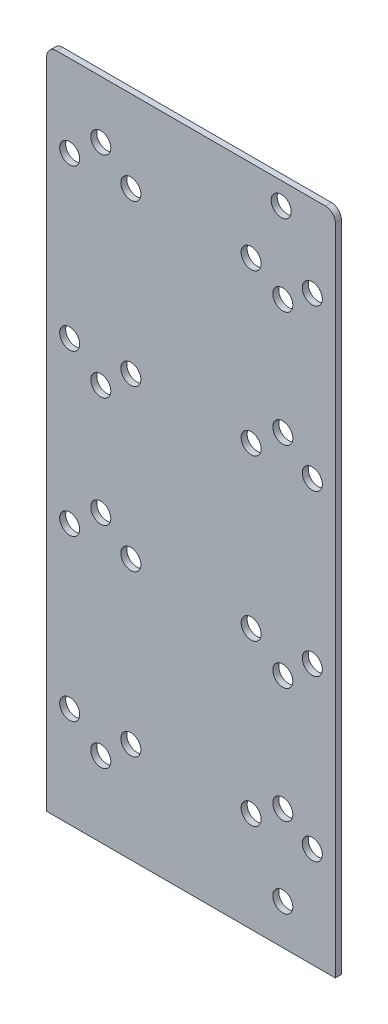
ISO-10303-21;
HEADER;
FILE_DESCRIPTION(('STEP AP214'),'2;1');
FILE_NAME('part.step','',(''),(''),'','','');
FILE_SCHEMA(('AUTOMOTIVE_DESIGN { 1 0 10303 214 1 1 1 1 }'));
ENDSEC;
DATA;
#1=APPLICATION_CONTEXT('core data for automotive mechanical design processes');
#2=APPLICATION_PROTOCOL_DEFINITION('international standard','automotive_design',2000,#1);
#3=PRODUCT_CONTEXT('',#1,'mechanical');
#4=PRODUCT('Part','Part','',(#3));
#5=PRODUCT_RELATED_PRODUCT_CATEGORY('part','',(#4));
#6=PRODUCT_DEFINITION_FORMATION('','',#4);
#7=PRODUCT_DEFINITION_CONTEXT('part definition',#1,'design');
#8=PRODUCT_DEFINITION('design','',#6,#7);
#9=PRODUCT_DEFINITION_SHAPE('','',#8);
#10=(LENGTH_UNIT() NAMED_UNIT(*) SI_UNIT(.MILLI.,.METRE.));
#11=(NAMED_UNIT(*) PLANE_ANGLE_UNIT() SI_UNIT($,.RADIAN.));
#12=(NAMED_UNIT(*) SI_UNIT($,.STERADIAN.) SOLID_ANGLE_UNIT());
#13=UNCERTAINTY_MEASURE_WITH_UNIT(LENGTH_MEASURE(1.E-05),#10,'distance_accuracy_value','');
#14=(GEOMETRIC_REPRESENTATION_CONTEXT(3) GLOBAL_UNCERTAINTY_ASSIGNED_CONTEXT((#13)) GLOBAL_UNIT_ASSIGNED_CONTEXT((#10,
#11,#12)) REPRESENTATION_CONTEXT('',''));
#15=CARTESIAN_POINT('',(0.,0.,0.));
#16=DIRECTION('',(0.,0.,1.));
#17=DIRECTION('',(1.,0.,0.));
#18=AXIS2_PLACEMENT_3D('',#15,#16,#17);
#19=CARTESIAN_POINT('',(-11.1488200453154,493.39742900995,-7.));
#20=DIRECTION('',(0.,0.,1.));
#21=DIRECTION('',(1.,0.,0.));
#22=AXIS2_PLACEMENT_3D('',#19,#20,#21);
#23=CYLINDRICAL_SURFACE('',#22,5.);
#24=CARTESIAN_POINT('',(-11.1488200453154,493.39742900995,3.));
#25=DIRECTION('',(0.,0.,1.));
#26=DIRECTION('',(1.,0.,0.));
#27=AXIS2_PLACEMENT_3D('',#24,#25,#26);
#28=CIRCLE('',#27,5.);
#29=CARTESIAN_POINT('',(-6.14882004531543,493.39742900995,3.));
#30=VERTEX_POINT('',#29);
#31=EDGE_CURVE('E165',#30,#30,#28,.T.);
#32=ORIENTED_EDGE('',*,*,#31,.T.);
#33=EDGE_LOOP('',(#32));
#34=FACE_BOUND('',#33,.T.);
#35=CARTESIAN_POINT('',(-11.1488200453154,493.39742900995,0.));
#36=DIRECTION('',(0.,0.,1.));
#37=DIRECTION('',(1.,0.,0.));
#38=AXIS2_PLACEMENT_3D('',#35,#36,#37);
#39=CIRCLE('',#38,5.);
#40=CARTESIAN_POINT('',(-6.14882004531543,493.39742900995,0.));
#41=VERTEX_POINT('',#40);
#42=EDGE_CURVE('E168',#41,#41,#39,.T.);
#43=ORIENTED_EDGE('',*,*,#42,.F.);
#44=EDGE_LOOP('',(#43));
#45=FACE_BOUND('',#44,.T.);
#46=ADVANCED_FACE('F35',(#34,#45),#23,.F.);
#47=CARTESIAN_POINT('',(-11.1488200453154,413.39742900995,-7.));
#48=DIRECTION('',(0.,0.,1.));
#49=DIRECTION('',(1.,0.,0.));
#50=AXIS2_PLACEMENT_3D('',#47,#48,#49);
#51=CYLINDRICAL_SURFACE('',#50,5.);
#52=CARTESIAN_POINT('',(-11.1488200453154,413.39742900995,3.));
#53=DIRECTION('',(0.,0.,1.));
#54=DIRECTION('',(1.,0.,0.));
#55=AXIS2_PLACEMENT_3D('',#52,#53,#54);
#56=CIRCLE('',#55,5.);
#57=CARTESIAN_POINT('',(-6.14882004531542,413.39742900995,3.));
#58=VERTEX_POINT('',#57);
#59=EDGE_CURVE('E159',#58,#58,#56,.T.);
#60=ORIENTED_EDGE('',*,*,#59,.T.);
#61=EDGE_LOOP('',(#60));
#62=FACE_BOUND('',#61,.T.);
#63=CARTESIAN_POINT('',(-11.1488200453154,413.39742900995,0.));
#64=DIRECTION('',(0.,0.,1.));
#65=DIRECTION('',(1.,0.,0.));
#66=AXIS2_PLACEMENT_3D('',#63,#64,#65);
#67=CIRCLE('',#66,5.);
#68=CARTESIAN_POINT('',(-6.14882004531542,413.39742900995,0.));
#69=VERTEX_POINT('',#68);
#70=EDGE_CURVE('E162',#69,#69,#67,.T.);
#71=ORIENTED_EDGE('',*,*,#70,.F.);
#72=EDGE_LOOP('',(#71));
#73=FACE_BOUND('',#72,.T.);
#74=ADVANCED_FACE('F205',(#62,#73),#51,.F.);
#75=CARTESIAN_POINT('',(48.8511799546846,493.39742900995,-7.));
#76=DIRECTION('',(0.,0.,1.));
#77=DIRECTION('',(1.,0.,0.));
#78=AXIS2_PLACEMENT_3D('',#75,#76,#77);
#79=CYLINDRICAL_SURFACE('',#78,5.);
#80=CARTESIAN_POINT('',(48.8511799546846,493.39742900995,3.));
#81=DIRECTION('',(0.,0.,1.));
#82=DIRECTION('',(1.,0.,0.));
#83=AXIS2_PLACEMENT_3D('',#80,#81,#82);
#84=CIRCLE('',#83,5.);
#85=CARTESIAN_POINT('',(53.8511799546846,493.39742900995,3.));
#86=VERTEX_POINT('',#85);
#87=EDGE_CURVE('E153',#86,#86,#84,.T.);
#88=ORIENTED_EDGE('',*,*,#87,.T.);
#89=EDGE_LOOP('',(#88));
#90=FACE_BOUND('',#89,.T.);
#91=CARTESIAN_POINT('',(48.8511799546846,493.39742900995,0.));
#92=DIRECTION('',(0.,0.,1.));
#93=DIRECTION('',(1.,0.,0.));
#94=AXIS2_PLACEMENT_3D('',#91,#92,#93);
#95=CIRCLE('',#94,5.);
#96=CARTESIAN_POINT('',(53.8511799546846,493.39742900995,0.));
#97=VERTEX_POINT('',#96);
#98=EDGE_CURVE('E156',#97,#97,#95,.T.);
#99=ORIENTED_EDGE('',*,*,#98,.F.);
#100=EDGE_LOOP('',(#99));
#101=FACE_BOUND('',#100,.T.);
#102=ADVANCED_FACE('F211',(#90,#101),#79,.F.);
#103=CARTESIAN_POINT('',(48.8511799546846,413.39742900995,-7.));
#104=DIRECTION('',(0.,0.,1.));
#105=DIRECTION('',(1.,0.,0.));
#106=AXIS2_PLACEMENT_3D('',#103,#104,#105);
#107=CYLINDRICAL_SURFACE('',#106,5.);
#108=CARTESIAN_POINT('',(48.8511799546846,413.39742900995,3.));
#109=DIRECTION('',(0.,0.,1.));
#110=DIRECTION('',(1.,0.,0.));
#111=AXIS2_PLACEMENT_3D('',#108,#109,#110);
#112=CIRCLE('',#111,5.);
#113=CARTESIAN_POINT('',(53.8511799546846,413.39742900995,3.));
#114=VERTEX_POINT('',#113);
#115=EDGE_CURVE('E147',#114,#114,#112,.T.);
#116=ORIENTED_EDGE('',*,*,#115,.T.);
#117=EDGE_LOOP('',(#116));
#118=FACE_BOUND('',#117,.T.);
#119=CARTESIAN_POINT('',(48.8511799546846,413.39742900995,0.));
#120=DIRECTION('',(0.,0.,1.));
#121=DIRECTION('',(1.,0.,0.));
#122=AXIS2_PLACEMENT_3D('',#119,#120,#121);
#123=CIRCLE('',#122,5.);
#124=CARTESIAN_POINT('',(53.8511799546846,413.39742900995,0.));
#125=VERTEX_POINT('',#124);
#126=EDGE_CURVE('E150',#125,#125,#123,.T.);
#127=ORIENTED_EDGE('',*,*,#126,.F.);
#128=EDGE_LOOP('',(#127));
#129=FACE_BOUND('',#128,.T.);
#130=ADVANCED_FACE('F218',(#118,#129),#107,.F.);
#131=CARTESIAN_POINT('',(79.3511799546846,493.39742900995,-7.));
#132=DIRECTION('',(0.,0.,1.));
#133=DIRECTION('',(1.,0.,0.));
#134=AXIS2_PLACEMENT_3D('',#131,#132,#133);
#135=CYLINDRICAL_SURFACE('',#134,5.00000000000001);
#136=CARTESIAN_POINT('',(79.3511799546846,493.39742900995,3.));
#137=DIRECTION('',(0.,0.,1.));
#138=DIRECTION('',(1.,0.,0.));
#139=AXIS2_PLACEMENT_3D('',#136,#137,#138);
#140=CIRCLE('',#139,5.00000000000001);
#141=CARTESIAN_POINT('',(84.3511799546846,493.39742900995,3.));
#142=VERTEX_POINT('',#141);
#143=EDGE_CURVE('E141',#142,#142,#140,.T.);
#144=ORIENTED_EDGE('',*,*,#143,.T.);
#145=EDGE_LOOP('',(#144));
#146=FACE_BOUND('',#145,.T.);
#147=CARTESIAN_POINT('',(79.3511799546846,493.39742900995,0.));
#148=DIRECTION('',(0.,0.,1.));
#149=DIRECTION('',(1.,0.,0.));
#150=AXIS2_PLACEMENT_3D('',#147,#148,#149);
#151=CIRCLE('',#150,5.00000000000001);
#152=CARTESIAN_POINT('',(84.3511799546846,493.39742900995,0.));
#153=VERTEX_POINT('',#152);
#154=EDGE_CURVE('E144',#153,#153,#151,.T.);
#155=ORIENTED_EDGE('',*,*,#154,.F.);
#156=EDGE_LOOP('',(#155));
#157=FACE_BOUND('',#156,.T.);
#158=ADVANCED_FACE('F222',(#146,#157),#135,.F.);
#159=CARTESIAN_POINT('',(79.3511799546846,413.39742900995,-7.));
#160=DIRECTION('',(0.,0.,1.));
#161=DIRECTION('',(1.,0.,0.));
#162=AXIS2_PLACEMENT_3D('',#159,#160,#161);
#163=CYLINDRICAL_SURFACE('',#162,5.00000000000001);
#164=CARTESIAN_POINT('',(79.3511799546846,413.39742900995,3.));
#165=DIRECTION('',(0.,0.,1.));
#166=DIRECTION('',(1.,0.,0.));
#167=AXIS2_PLACEMENT_3D('',#164,#165,#166);
#168=CIRCLE('',#167,5.00000000000001);
#169=CARTESIAN_POINT('',(84.3511799546846,413.39742900995,3.));
#170=VERTEX_POINT('',#169);
#171=EDGE_CURVE('E135',#170,#170,#168,.T.);
#172=ORIENTED_EDGE('',*,*,#171,.T.);
#173=EDGE_LOOP('',(#172));
#174=FACE_BOUND('',#173,.T.);
#175=CARTESIAN_POINT('',(79.3511799546846,413.39742900995,0.));
#176=DIRECTION('',(0.,0.,1.));
#177=DIRECTION('',(1.,0.,0.));
#178=AXIS2_PLACEMENT_3D('',#175,#176,#177);
#179=CIRCLE('',#178,5.00000000000001);
#180=CARTESIAN_POINT('',(84.3511799546846,413.39742900995,0.));
#181=VERTEX_POINT('',#180);
#182=EDGE_CURVE('E138',#181,#181,#179,.T.);
#183=ORIENTED_EDGE('',*,*,#182,.F.);
#184=EDGE_LOOP('',(#183));
#185=FACE_BOUND('',#184,.T.);
#186=ADVANCED_FACE('F226',(#174,#185),#163,.F.);
#187=CARTESIAN_POINT('',(-41.6488200453154,493.39742900995,-7.));
#188=DIRECTION('',(0.,0.,1.));
#189=DIRECTION('',(1.,0.,0.));
#190=AXIS2_PLACEMENT_3D('',#187,#188,#189);
#191=CYLINDRICAL_SURFACE('',#190,5.);
#192=CARTESIAN_POINT('',(-41.6488200453154,493.39742900995,3.));
#193=DIRECTION('',(0.,0.,1.));
#194=DIRECTION('',(1.,0.,0.));
#195=AXIS2_PLACEMENT_3D('',#192,#193,#194);
#196=CIRCLE('',#195,5.);
#197=CARTESIAN_POINT('',(-36.6488200453154,493.39742900995,3.));
#198=VERTEX_POINT('',#197);
#199=EDGE_CURVE('E129',#198,#198,#196,.T.);
#200=ORIENTED_EDGE('',*,*,#199,.T.);
#201=EDGE_LOOP('',(#200));
#202=FACE_BOUND('',#201,.T.);
#203=CARTESIAN_POINT('',(-41.6488200453154,493.39742900995,0.));
#204=DIRECTION('',(0.,0.,1.));
#205=DIRECTION('',(1.,0.,0.));
#206=AXIS2_PLACEMENT_3D('',#203,#204,#205);
#207=CIRCLE('',#206,5.);
#208=CARTESIAN_POINT('',(-36.6488200453154,493.39742900995,0.));
#209=VERTEX_POINT('',#208);
#210=EDGE_CURVE('E132',#209,#209,#207,.T.);
#211=ORIENTED_EDGE('',*,*,#210,.F.);
#212=EDGE_LOOP('',(#211));
#213=FACE_BOUND('',#212,.T.);
#214=ADVANCED_FACE('F230',(#202,#213),#191,.F.);
#215=CARTESIAN_POINT('',(-41.6488200453154,413.39742900995,-7.));
#216=DIRECTION('',(0.,0.,1.));
#217=DIRECTION('',(1.,0.,0.));
#218=AXIS2_PLACEMENT_3D('',#215,#216,#217);
#219=CYLINDRICAL_SURFACE('',#218,5.);
#220=CARTESIAN_POINT('',(-41.6488200453154,413.39742900995,3.));
#221=DIRECTION('',(0.,0.,1.));
#222=DIRECTION('',(1.,0.,0.));
#223=AXIS2_PLACEMENT_3D('',#220,#221,#222);
#224=CIRCLE('',#223,5.);
#225=CARTESIAN_POINT('',(-36.6488200453154,413.39742900995,3.));
#226=VERTEX_POINT('',#225);
#227=EDGE_CURVE('E122',#226,#226,#224,.T.);
#228=ORIENTED_EDGE('',*,*,#227,.T.);
#229=EDGE_LOOP('',(#228));
#230=FACE_BOUND('',#229,.T.);
#231=CARTESIAN_POINT('',(-41.6488200453154,413.39742900995,0.));
#232=DIRECTION('',(0.,0.,1.));
#233=DIRECTION('',(1.,0.,0.));
#234=AXIS2_PLACEMENT_3D('',#231,#232,#233);
#235=CIRCLE('',#234,5.);
#236=CARTESIAN_POINT('',(-36.6488200453154,413.39742900995,0.));
#237=VERTEX_POINT('',#236);
#238=EDGE_CURVE('E126',#237,#237,#235,.T.);
#239=ORIENTED_EDGE('',*,*,#238,.F.);
#240=EDGE_LOOP('',(#239));
#241=FACE_BOUND('',#240,.T.);
#242=ADVANCED_FACE('F234',(#230,#241),#219,.F.);
#243=CARTESIAN_POINT('',(-53.1488200453154,534.39742900995,0.));
#244=DIRECTION('',(-1.,0.,0.));
#245=DIRECTION('',(0.,-1.,0.));
#246=AXIS2_PLACEMENT_3D('',#243,#244,#245);
#247=PLANE('',#246);
#248=DIRECTION('',(0.,-1.,0.));
#249=VECTOR('',#248,1.);
#250=CARTESIAN_POINT('',(-53.1488200453154,534.39742900995,3.));
#251=LINE('',#250,#249);
#252=CARTESIAN_POINT('',(-53.1488200453154,529.39742900995,3.));
#253=VERTEX_POINT('',#252);
#254=CARTESIAN_POINT('',(-53.1488200453154,203.39742900995,3.));
#255=VERTEX_POINT('',#254);
#256=EDGE_CURVE('E113',#253,#255,#251,.T.);
#257=ORIENTED_EDGE('',*,*,#256,.F.);
#258=DIRECTION('',(0.,0.,1.));
#259=VECTOR('',#258,1.);
#260=CARTESIAN_POINT('',(-53.1488200453154,529.39742900995,0.));
#261=LINE('',#260,#259);
#262=CARTESIAN_POINT('',(-53.1488200453154,529.39742900995,0.));
#263=VERTEX_POINT('',#262);
#264=EDGE_CURVE('E11',#253,#263,#261,.F.);
#265=ORIENTED_EDGE('',*,*,#264,.T.);
#266=DIRECTION('',(0.,-1.,0.));
#267=VECTOR('',#266,1.);
#268=CARTESIAN_POINT('',(-53.1488200453154,534.39742900995,0.));
#269=LINE('',#268,#267);
#270=CARTESIAN_POINT('',(-53.1488200453154,203.39742900995,0.));
#271=VERTEX_POINT('',#270);
#272=EDGE_CURVE('E86',#263,#271,#269,.T.);
#273=ORIENTED_EDGE('',*,*,#272,.T.);
#274=DIRECTION('',(0.,0.,1.));
#275=VECTOR('',#274,1.);
#276=CARTESIAN_POINT('',(-53.1488200453154,203.39742900995,0.));
#277=LINE('',#276,#275);
#278=EDGE_CURVE('E89',#271,#255,#277,.T.);
#279=ORIENTED_EDGE('',*,*,#278,.T.);
#280=EDGE_LOOP('',(#257,#265,#273,#279));
#281=FACE_BOUND('',#280,.T.);
#282=ADVANCED_FACE('F88',(#281),#247,.T.);
#283=CARTESIAN_POINT('',(-53.1488200453154,534.39742900995,0.));
#284=DIRECTION('',(0.,1.,0.));
#285=DIRECTION('',(0.,0.,1.));
#286=AXIS2_PLACEMENT_3D('',#283,#284,#285);
#287=PLANE('',#286);
#288=DIRECTION('',(-1.,0.,0.));
#289=VECTOR('',#288,1.);
#290=CARTESIAN_POINT('',(-53.1488200453154,534.39742900995,3.));
#291=LINE('',#290,#289);
#292=CARTESIAN_POINT('',(85.8511799546846,534.39742900995,3.));
#293=VERTEX_POINT('',#292);
#294=CARTESIAN_POINT('',(-48.1488200453154,534.39742900995,3.));
#295=VERTEX_POINT('',#294);
#296=EDGE_CURVE('E93',#293,#295,#291,.T.);
#297=ORIENTED_EDGE('',*,*,#296,.F.);
#298=DIRECTION('',(0.,0.,1.));
#299=VECTOR('',#298,1.);
#300=CARTESIAN_POINT('',(85.8511799546846,534.39742900995,0.));
#301=LINE('',#300,#299);
#302=CARTESIAN_POINT('',(85.8511799546846,534.39742900995,0.));
#303=VERTEX_POINT('',#302);
#304=EDGE_CURVE('E181',#293,#303,#301,.F.);
#305=ORIENTED_EDGE('',*,*,#304,.T.);
#306=DIRECTION('',(-1.,0.,0.));
#307=VECTOR('',#306,1.);
#308=CARTESIAN_POINT('',(-53.1488200453154,534.39742900995,0.));
#309=LINE('',#308,#307);
#310=CARTESIAN_POINT('',(-48.1488200453154,534.39742900995,0.));
#311=VERTEX_POINT('',#310);
#312=EDGE_CURVE('E101',#303,#311,#309,.T.);
#313=ORIENTED_EDGE('',*,*,#312,.T.);
#314=DIRECTION('',(0.,0.,1.));
#315=VECTOR('',#314,1.);
#316=CARTESIAN_POINT('',(-48.1488200453154,534.39742900995,0.));
#317=LINE('',#316,#315);
#318=EDGE_CURVE('E178',#311,#295,#317,.T.);
#319=ORIENTED_EDGE('',*,*,#318,.T.);
#320=EDGE_LOOP('',(#297,#305,#313,#319));
#321=FACE_BOUND('',#320,.T.);
#322=ADVANCED_FACE('F196',(#321),#287,.T.);
#323=CARTESIAN_POINT('',(90.8511799546846,534.39742900995,0.));
#324=DIRECTION('',(1.,0.,0.));
#325=DIRECTION('',(0.,1.,0.));
#326=AXIS2_PLACEMENT_3D('',#323,#324,#325);
#327=PLANE('',#326);
#328=DIRECTION('',(0.,1.,0.));
#329=VECTOR('',#328,1.);
#330=CARTESIAN_POINT('',(90.8511799546846,534.39742900995,0.));
#331=LINE('',#330,#329);
#332=CARTESIAN_POINT('',(90.8511799546846,203.39742900995,0.));
#333=VERTEX_POINT('',#332);
#334=CARTESIAN_POINT('',(90.8511799546846,529.39742900995,0.));
#335=VERTEX_POINT('',#334);
#336=EDGE_CURVE('E107',#333,#335,#331,.T.);
#337=ORIENTED_EDGE('',*,*,#336,.T.);
#338=DIRECTION('',(0.,0.,1.));
#339=VECTOR('',#338,1.);
#340=CARTESIAN_POINT('',(90.8511799546846,529.39742900995,0.));
#341=LINE('',#340,#339);
#342=CARTESIAN_POINT('',(90.8511799546846,529.39742900995,3.));
#343=VERTEX_POINT('',#342);
#344=EDGE_CURVE('E171',#335,#343,#341,.T.);
#345=ORIENTED_EDGE('',*,*,#344,.T.);
#346=DIRECTION('',(0.,1.,0.));
#347=VECTOR('',#346,1.);
#348=CARTESIAN_POINT('',(90.8511799546846,534.39742900995,3.));
#349=LINE('',#348,#347);
#350=CARTESIAN_POINT('',(90.8511799546846,203.39742900995,3.));
#351=VERTEX_POINT('',#350);
#352=EDGE_CURVE('E117',#351,#343,#349,.T.);
#353=ORIENTED_EDGE('',*,*,#352,.F.);
#354=DIRECTION('',(0.,0.,1.));
#355=VECTOR('',#354,1.);
#356=CARTESIAN_POINT('',(90.8511799546846,203.39742900995,0.));
#357=LINE('',#356,#355);
#358=EDGE_CURVE('E100',#333,#351,#357,.T.);
#359=ORIENTED_EDGE('',*,*,#358,.F.);
#360=EDGE_LOOP('',(#337,#345,#353,#359));
#361=FACE_BOUND('',#360,.T.);
#362=ADVANCED_FACE('F188',(#361),#327,.T.);
#363=CARTESIAN_POINT('',(-53.1488200453154,203.39742900995,0.));
#364=DIRECTION('',(0.,-1.,0.));
#365=DIRECTION('',(0.,0.,-1.));
#366=AXIS2_PLACEMENT_3D('',#363,#364,#365);
#367=PLANE('',#366);
#368=DIRECTION('',(1.,0.,0.));
#369=VECTOR('',#368,1.);
#370=CARTESIAN_POINT('',(-53.1488200453154,203.39742900995,3.));
#371=LINE('',#370,#369);
#372=EDGE_CURVE('E99',#255,#351,#371,.T.);
#373=ORIENTED_EDGE('',*,*,#372,.F.);
#374=ORIENTED_EDGE('',*,*,#278,.F.);
#375=DIRECTION('',(1.,0.,0.));
#376=VECTOR('',#375,1.);
#377=CARTESIAN_POINT('',(-53.1488200453154,203.39742900995,0.));
#378=LINE('',#377,#376);
#379=EDGE_CURVE('E92',#271,#333,#378,.T.);
#380=ORIENTED_EDGE('',*,*,#379,.T.);
#381=ORIENTED_EDGE('',*,*,#358,.T.);
#382=EDGE_LOOP('',(#373,#374,#380,#381));
#383=FACE_BOUND('',#382,.T.);
#384=ADVANCED_FACE('F97',(#383),#367,.T.);
#385=CARTESIAN_POINT('',(0.,0.,0.));
#386=DIRECTION('',(0.,0.,1.));
#387=DIRECTION('',(1.,0.,0.));
#388=AXIS2_PLACEMENT_3D('',#385,#386,#387);
#389=PLANE('',#388);
#390=CARTESIAN_POINT('',(-11.1488200453154,333.39742900995,0.));
#391=DIRECTION('',(0.,0.,1.));
#392=DIRECTION('',(1.,0.,0.));
#393=AXIS2_PLACEMENT_3D('',#390,#391,#392);
#394=CIRCLE('',#393,5.);
#395=CARTESIAN_POINT('',(-6.14882004531541,333.39742900995,0.));
#396=VERTEX_POINT('',#395);
#397=EDGE_CURVE('E331',#396,#396,#394,.T.);
#398=ORIENTED_EDGE('',*,*,#397,.T.);
#399=EDGE_LOOP('',(#398));
#400=FACE_BOUND('',#399,.T.);
#401=CARTESIAN_POINT('',(48.8511799546846,333.39742900995,0.));
#402=DIRECTION('',(0.,0.,1.));
#403=DIRECTION('',(1.,0.,0.));
#404=AXIS2_PLACEMENT_3D('',#401,#402,#403);
#405=CIRCLE('',#404,5.);
#406=CARTESIAN_POINT('',(53.8511799546846,333.39742900995,0.));
#407=VERTEX_POINT('',#406);
#408=EDGE_CURVE('E335',#407,#407,#405,.T.);
#409=ORIENTED_EDGE('',*,*,#408,.T.);
#410=EDGE_LOOP('',(#409));
#411=FACE_BOUND('',#410,.T.);
#412=CARTESIAN_POINT('',(79.3511799546846,333.39742900995,0.));
#413=DIRECTION('',(0.,0.,1.));
#414=DIRECTION('',(1.,0.,0.));
#415=AXIS2_PLACEMENT_3D('',#412,#413,#414);
#416=CIRCLE('',#415,5.00000000000001);
#417=CARTESIAN_POINT('',(84.3511799546846,333.39742900995,0.));
#418=VERTEX_POINT('',#417);
#419=EDGE_CURVE('E344',#418,#418,#416,.T.);
#420=ORIENTED_EDGE('',*,*,#419,.T.);
#421=EDGE_LOOP('',(#420));
#422=FACE_BOUND('',#421,.T.);
#423=CARTESIAN_POINT('',(-41.6488200453154,333.39742900995,0.));
#424=DIRECTION('',(0.,0.,1.));
#425=DIRECTION('',(1.,0.,0.));
#426=AXIS2_PLACEMENT_3D('',#423,#424,#425);
#427=CIRCLE('',#426,5.);
#428=CARTESIAN_POINT('',(-36.6488200453154,333.39742900995,0.));
#429=VERTEX_POINT('',#428);
#430=EDGE_CURVE('E350',#429,#429,#427,.T.);
#431=ORIENTED_EDGE('',*,*,#430,.T.);
#432=EDGE_LOOP('',(#431));
#433=FACE_BOUND('',#432,.T.);
#434=CARTESIAN_POINT('',(-41.6488200453154,253.39742900995,0.));
#435=DIRECTION('',(0.,0.,1.));
#436=DIRECTION('',(1.,0.,0.));
#437=AXIS2_PLACEMENT_3D('',#434,#435,#436);
#438=CIRCLE('',#437,5.);
#439=CARTESIAN_POINT('',(-36.6488200453154,253.39742900995,0.));
#440=VERTEX_POINT('',#439);
#441=EDGE_CURVE('E374',#440,#440,#438,.T.);
#442=ORIENTED_EDGE('',*,*,#441,.T.);
#443=EDGE_LOOP('',(#442));
#444=FACE_BOUND('',#443,.T.);
#445=CARTESIAN_POINT('',(-11.1488200453154,253.39742900995,0.));
#446=DIRECTION('',(0.,0.,1.));
#447=DIRECTION('',(1.,0.,0.));
#448=AXIS2_PLACEMENT_3D('',#445,#446,#447);
#449=CIRCLE('',#448,5.);
#450=CARTESIAN_POINT('',(-6.1488200453154,253.39742900995,0.));
#451=VERTEX_POINT('',#450);
#452=EDGE_CURVE('E371',#451,#451,#449,.T.);
#453=ORIENTED_EDGE('',*,*,#452,.T.);
#454=EDGE_LOOP('',(#453));
#455=FACE_BOUND('',#454,.T.);
#456=CARTESIAN_POINT('',(48.8511799546846,253.39742900995,0.));
#457=DIRECTION('',(0.,0.,1.));
#458=DIRECTION('',(1.,0.,0.));
#459=AXIS2_PLACEMENT_3D('',#456,#457,#458);
#460=CIRCLE('',#459,5.);
#461=CARTESIAN_POINT('',(53.8511799546846,253.39742900995,0.));
#462=VERTEX_POINT('',#461);
#463=EDGE_CURVE('E368',#462,#462,#460,.T.);
#464=ORIENTED_EDGE('',*,*,#463,.T.);
#465=EDGE_LOOP('',(#464));
#466=FACE_BOUND('',#465,.T.);
#467=CARTESIAN_POINT('',(79.3511799546846,253.39742900995,0.));
#468=DIRECTION('',(0.,0.,1.));
#469=DIRECTION('',(1.,0.,0.));
#470=AXIS2_PLACEMENT_3D('',#467,#468,#469);
#471=CIRCLE('',#470,5.00000000000001);
#472=CARTESIAN_POINT('',(84.3511799546846,253.39742900995,0.));
#473=VERTEX_POINT('',#472);
#474=EDGE_CURVE('E357',#473,#473,#471,.T.);
#475=ORIENTED_EDGE('',*,*,#474,.T.);
#476=EDGE_LOOP('',(#475));
#477=FACE_BOUND('',#476,.T.);
#478=CARTESIAN_POINT('',(-26.1488200453154,505.89742900995,0.));
#479=DIRECTION('',(0.,0.,1.));
#480=DIRECTION('',(1.,0.,0.));
#481=AXIS2_PLACEMENT_3D('',#478,#479,#480);
#482=CIRCLE('',#481,5.);
#483=CARTESIAN_POINT('',(-21.1488200453154,505.89742900995,0.));
#484=VERTEX_POINT('',#483);
#485=EDGE_CURVE('E398',#484,#484,#482,.T.);
#486=ORIENTED_EDGE('',*,*,#485,.T.);
#487=EDGE_LOOP('',(#486));
#488=FACE_BOUND('',#487,.T.);
#489=CARTESIAN_POINT('',(-26.1488200453154,400.89742900995,0.));
#490=DIRECTION('',(0.,0.,1.));
#491=DIRECTION('',(1.,0.,0.));
#492=AXIS2_PLACEMENT_3D('',#489,#490,#491);
#493=CIRCLE('',#492,5.);
#494=CARTESIAN_POINT('',(-21.1488200453154,400.89742900995,0.));
#495=VERTEX_POINT('',#494);
#496=EDGE_CURVE('E395',#495,#495,#493,.T.);
#497=ORIENTED_EDGE('',*,*,#496,.T.);
#498=EDGE_LOOP('',(#497));
#499=FACE_BOUND('',#498,.T.);
#500=CARTESIAN_POINT('',(-26.1488200453154,345.89742900995,0.));
#501=DIRECTION('',(0.,0.,1.));
#502=DIRECTION('',(1.,0.,0.));
#503=AXIS2_PLACEMENT_3D('',#500,#501,#502);
#504=CIRCLE('',#503,5.);
#505=CARTESIAN_POINT('',(-21.1488200453154,345.89742900995,0.));
#506=VERTEX_POINT('',#505);
#507=EDGE_CURVE('E392',#506,#506,#504,.T.);
#508=ORIENTED_EDGE('',*,*,#507,.T.);
#509=EDGE_LOOP('',(#508));
#510=FACE_BOUND('',#509,.T.);
#511=CARTESIAN_POINT('',(-26.1488200453154,240.89742900995,0.));
#512=DIRECTION('',(0.,0.,1.));
#513=DIRECTION('',(1.,0.,0.));
#514=AXIS2_PLACEMENT_3D('',#511,#512,#513);
#515=CIRCLE('',#514,5.);
#516=CARTESIAN_POINT('',(-21.1488200453154,240.89742900995,0.));
#517=VERTEX_POINT('',#516);
#518=EDGE_CURVE('E381',#517,#517,#515,.T.);
#519=ORIENTED_EDGE('',*,*,#518,.T.);
#520=EDGE_LOOP('',(#519));
#521=FACE_BOUND('',#520,.T.);
#522=CARTESIAN_POINT('',(63.8511799546846,523.39742900995,0.));
#523=DIRECTION('',(0.,0.,1.));
#524=DIRECTION('',(1.,0.,0.));
#525=AXIS2_PLACEMENT_3D('',#522,#523,#524);
#526=CIRCLE('',#525,5.00000000000001);
#527=CARTESIAN_POINT('',(68.8511799546846,523.39742900995,0.));
#528=VERTEX_POINT('',#527);
#529=EDGE_CURVE('E115',#528,#528,#526,.T.);
#530=ORIENTED_EDGE('',*,*,#529,.T.);
#531=EDGE_LOOP('',(#530));
#532=FACE_BOUND('',#531,.T.);
#533=CARTESIAN_POINT('',(64.6359076863658,483.39742900995,0.));
#534=DIRECTION('',(0.,0.,1.));
#535=DIRECTION('',(1.,0.,0.));
#536=AXIS2_PLACEMENT_3D('',#533,#534,#535);
#537=CIRCLE('',#536,5.00000000000001);
#538=CARTESIAN_POINT('',(69.6359076863659,483.39742900995,0.));
#539=VERTEX_POINT('',#538);
#540=EDGE_CURVE('E407',#539,#539,#537,.T.);
#541=ORIENTED_EDGE('',*,*,#540,.T.);
#542=EDGE_LOOP('',(#541));
#543=FACE_BOUND('',#542,.T.);
#544=CARTESIAN_POINT('',(64.6359076863658,425.89742900995,0.));
#545=DIRECTION('',(0.,0.,1.));
#546=DIRECTION('',(1.,0.,0.));
#547=AXIS2_PLACEMENT_3D('',#544,#545,#546);
#548=CIRCLE('',#547,5.00000000000001);
#549=CARTESIAN_POINT('',(69.6359076863659,425.89742900995,0.));
#550=VERTEX_POINT('',#549);
#551=EDGE_CURVE('E413',#550,#550,#548,.T.);
#552=ORIENTED_EDGE('',*,*,#551,.T.);
#553=EDGE_LOOP('',(#552));
#554=FACE_BOUND('',#553,.T.);
#555=CARTESIAN_POINT('',(64.6359076863658,320.89742900995,0.));
#556=DIRECTION('',(0.,0.,1.));
#557=DIRECTION('',(1.,0.,0.));
#558=AXIS2_PLACEMENT_3D('',#555,#556,#557);
#559=CIRCLE('',#558,5.00000000000001);
#560=CARTESIAN_POINT('',(69.6359076863659,320.89742900995,0.));
#561=VERTEX_POINT('',#560);
#562=EDGE_CURVE('E419',#561,#561,#559,.T.);
#563=ORIENTED_EDGE('',*,*,#562,.T.);
#564=EDGE_LOOP('',(#563));
#565=FACE_BOUND('',#564,.T.);
#566=CARTESIAN_POINT('',(64.6359076863658,263.39742900995,0.));
#567=DIRECTION('',(0.,0.,1.));
#568=DIRECTION('',(1.,0.,0.));
#569=AXIS2_PLACEMENT_3D('',#566,#567,#568);
#570=CIRCLE('',#569,5.00000000000001);
#571=CARTESIAN_POINT('',(69.6359076863659,263.39742900995,0.));
#572=VERTEX_POINT('',#571);
#573=EDGE_CURVE('E425',#572,#572,#570,.T.);
#574=ORIENTED_EDGE('',*,*,#573,.T.);
#575=EDGE_LOOP('',(#574));
#576=FACE_BOUND('',#575,.T.);
#577=CARTESIAN_POINT('',(64.6359076863658,223.39742900995,0.));
#578=DIRECTION('',(0.,0.,1.));
#579=DIRECTION('',(1.,0.,0.));
#580=AXIS2_PLACEMENT_3D('',#577,#578,#579);
#581=CIRCLE('',#580,5.00000000000001);
#582=CARTESIAN_POINT('',(69.6359076863659,223.39742900995,0.));
#583=VERTEX_POINT('',#582);
#584=EDGE_CURVE('E431',#583,#583,#581,.T.);
#585=ORIENTED_EDGE('',*,*,#584,.T.);
#586=EDGE_LOOP('',(#585));
#587=FACE_BOUND('',#586,.T.);
#588=ORIENTED_EDGE('',*,*,#312,.F.);
#589=CARTESIAN_POINT('',(85.8511799546846,529.39742900995,0.));
#590=DIRECTION('',(0.,0.,1.));
#591=DIRECTION('',(1.,0.,0.));
#592=AXIS2_PLACEMENT_3D('',#589,#590,#591);
#593=CIRCLE('',#592,5.);
#594=EDGE_CURVE('E43',#303,#335,#593,.F.);
#595=ORIENTED_EDGE('',*,*,#594,.T.);
#596=ORIENTED_EDGE('',*,*,#336,.F.);
#597=ORIENTED_EDGE('',*,*,#379,.F.);
#598=ORIENTED_EDGE('',*,*,#272,.F.);
#599=CARTESIAN_POINT('',(-48.1488200453154,529.39742900995,0.));
#600=DIRECTION('',(0.,0.,1.));
#601=DIRECTION('',(1.,0.,0.));
#602=AXIS2_PLACEMENT_3D('',#599,#600,#601);
#603=CIRCLE('',#602,5.);
#604=EDGE_CURVE('E55',#263,#311,#603,.F.);
#605=ORIENTED_EDGE('',*,*,#604,.T.);
#606=EDGE_LOOP('',(#588,#595,#596,#597,#598,#605));
#607=FACE_BOUND('',#606,.T.);
#608=ORIENTED_EDGE('',*,*,#238,.T.);
#609=EDGE_LOOP('',(#608));
#610=FACE_BOUND('',#609,.T.);
#611=ORIENTED_EDGE('',*,*,#210,.T.);
#612=EDGE_LOOP('',(#611));
#613=FACE_BOUND('',#612,.T.);
#614=ORIENTED_EDGE('',*,*,#182,.T.);
#615=EDGE_LOOP('',(#614));
#616=FACE_BOUND('',#615,.T.);
#617=ORIENTED_EDGE('',*,*,#154,.T.);
#618=EDGE_LOOP('',(#617));
#619=FACE_BOUND('',#618,.T.);
#620=ORIENTED_EDGE('',*,*,#126,.T.);
#621=EDGE_LOOP('',(#620));
#622=FACE_BOUND('',#621,.T.);
#623=ORIENTED_EDGE('',*,*,#98,.T.);
#624=EDGE_LOOP('',(#623));
#625=FACE_BOUND('',#624,.T.);
#626=ORIENTED_EDGE('',*,*,#70,.T.);
#627=EDGE_LOOP('',(#626));
#628=FACE_BOUND('',#627,.T.);
#629=ORIENTED_EDGE('',*,*,#42,.T.);
#630=EDGE_LOOP('',(#629));
#631=FACE_BOUND('',#630,.T.);
#632=ADVANCED_FACE('F104',(#400,#411,#422,#433,#444,#455,#466,#477,#488,#499,#510,#521,#532,
#543,#554,#565,#576,#587,#607,#610,#613,#616,#619,#622,#625,#628,#631),#389,.F.);
#633=CARTESIAN_POINT('',(0.,0.,3.));
#634=DIRECTION('',(0.,0.,1.));
#635=DIRECTION('',(1.,0.,0.));
#636=AXIS2_PLACEMENT_3D('',#633,#634,#635);
#637=PLANE('',#636);
#638=CARTESIAN_POINT('',(-11.1488200453154,333.39742900995,3.));
#639=DIRECTION('',(0.,0.,1.));
#640=DIRECTION('',(1.,0.,0.));
#641=AXIS2_PLACEMENT_3D('',#638,#639,#640);
#642=CIRCLE('',#641,5.);
#643=CARTESIAN_POINT('',(-6.14882004531541,333.39742900995,3.));
#644=VERTEX_POINT('',#643);
#645=EDGE_CURVE('E328',#644,#644,#642,.T.);
#646=ORIENTED_EDGE('',*,*,#645,.F.);
#647=EDGE_LOOP('',(#646));
#648=FACE_BOUND('',#647,.T.);
#649=CARTESIAN_POINT('',(48.8511799546846,333.39742900995,3.));
#650=DIRECTION('',(0.,0.,1.));
#651=DIRECTION('',(1.,0.,0.));
#652=AXIS2_PLACEMENT_3D('',#649,#650,#651);
#653=CIRCLE('',#652,5.);
#654=CARTESIAN_POINT('',(53.8511799546846,333.39742900995,3.));
#655=VERTEX_POINT('',#654);
#656=EDGE_CURVE('E332',#655,#655,#653,.T.);
#657=ORIENTED_EDGE('',*,*,#656,.F.);
#658=EDGE_LOOP('',(#657));
#659=FACE_BOUND('',#658,.T.);
#660=CARTESIAN_POINT('',(79.3511799546846,333.39742900995,3.));
#661=DIRECTION('',(0.,0.,1.));
#662=DIRECTION('',(1.,0.,0.));
#663=AXIS2_PLACEMENT_3D('',#660,#661,#662);
#664=CIRCLE('',#663,5.00000000000001);
#665=CARTESIAN_POINT('',(84.3511799546846,333.39742900995,3.));
#666=VERTEX_POINT('',#665);
#667=EDGE_CURVE('E341',#666,#666,#664,.T.);
#668=ORIENTED_EDGE('',*,*,#667,.F.);
#669=EDGE_LOOP('',(#668));
#670=FACE_BOUND('',#669,.T.);
#671=CARTESIAN_POINT('',(-41.6488200453154,333.39742900995,3.));
#672=DIRECTION('',(0.,0.,1.));
#673=DIRECTION('',(1.,0.,0.));
#674=AXIS2_PLACEMENT_3D('',#671,#672,#673);
#675=CIRCLE('',#674,5.);
#676=CARTESIAN_POINT('',(-36.6488200453154,333.39742900995,3.));
#677=VERTEX_POINT('',#676);
#678=EDGE_CURVE('E347',#677,#677,#675,.T.);
#679=ORIENTED_EDGE('',*,*,#678,.F.);
#680=EDGE_LOOP('',(#679));
#681=FACE_BOUND('',#680,.T.);
#682=CARTESIAN_POINT('',(-41.6488200453154,253.39742900995,3.));
#683=DIRECTION('',(0.,0.,1.));
#684=DIRECTION('',(1.,0.,0.));
#685=AXIS2_PLACEMENT_3D('',#682,#683,#684);
#686=CIRCLE('',#685,5.);
#687=CARTESIAN_POINT('',(-36.6488200453154,253.39742900995,3.));
#688=VERTEX_POINT('',#687);
#689=EDGE_CURVE('E354',#688,#688,#686,.T.);
#690=ORIENTED_EDGE('',*,*,#689,.F.);
#691=EDGE_LOOP('',(#690));
#692=FACE_BOUND('',#691,.T.);
#693=CARTESIAN_POINT('',(-11.1488200453154,253.39742900995,3.));
#694=DIRECTION('',(0.,0.,1.));
#695=DIRECTION('',(1.,0.,0.));
#696=AXIS2_PLACEMENT_3D('',#693,#694,#695);
#697=CIRCLE('',#696,5.);
#698=CARTESIAN_POINT('',(-6.1488200453154,253.39742900995,3.));
#699=VERTEX_POINT('',#698);
#700=EDGE_CURVE('E358',#699,#699,#697,.T.);
#701=ORIENTED_EDGE('',*,*,#700,.F.);
#702=EDGE_LOOP('',(#701));
#703=FACE_BOUND('',#702,.T.);
#704=CARTESIAN_POINT('',(48.8511799546846,253.39742900995,3.));
#705=DIRECTION('',(0.,0.,1.));
#706=DIRECTION('',(1.,0.,0.));
#707=AXIS2_PLACEMENT_3D('',#704,#705,#706);
#708=CIRCLE('',#707,5.);
#709=CARTESIAN_POINT('',(53.8511799546846,253.39742900995,3.));
#710=VERTEX_POINT('',#709);
#711=EDGE_CURVE('E361',#710,#710,#708,.T.);
#712=ORIENTED_EDGE('',*,*,#711,.F.);
#713=EDGE_LOOP('',(#712));
#714=FACE_BOUND('',#713,.T.);
#715=CARTESIAN_POINT('',(79.3511799546846,253.39742900995,3.));
#716=DIRECTION('',(0.,0.,1.));
#717=DIRECTION('',(1.,0.,0.));
#718=AXIS2_PLACEMENT_3D('',#715,#716,#717);
#719=CIRCLE('',#718,5.00000000000001);
#720=CARTESIAN_POINT('',(84.3511799546846,253.39742900995,3.));
#721=VERTEX_POINT('',#720);
#722=EDGE_CURVE('E353',#721,#721,#719,.T.);
#723=ORIENTED_EDGE('',*,*,#722,.F.);
#724=EDGE_LOOP('',(#723));
#725=FACE_BOUND('',#724,.T.);
#726=CARTESIAN_POINT('',(-26.1488200453154,505.89742900995,3.));
#727=DIRECTION('',(0.,0.,1.));
#728=DIRECTION('',(1.,0.,0.));
#729=AXIS2_PLACEMENT_3D('',#726,#727,#728);
#730=CIRCLE('',#729,5.);
#731=CARTESIAN_POINT('',(-21.1488200453154,505.89742900995,3.));
#732=VERTEX_POINT('',#731);
#733=EDGE_CURVE('E378',#732,#732,#730,.T.);
#734=ORIENTED_EDGE('',*,*,#733,.F.);
#735=EDGE_LOOP('',(#734));
#736=FACE_BOUND('',#735,.T.);
#737=CARTESIAN_POINT('',(-26.1488200453154,400.89742900995,3.));
#738=DIRECTION('',(0.,0.,1.));
#739=DIRECTION('',(1.,0.,0.));
#740=AXIS2_PLACEMENT_3D('',#737,#738,#739);
#741=CIRCLE('',#740,5.);
#742=CARTESIAN_POINT('',(-21.1488200453154,400.89742900995,3.));
#743=VERTEX_POINT('',#742);
#744=EDGE_CURVE('E382',#743,#743,#741,.T.);
#745=ORIENTED_EDGE('',*,*,#744,.F.);
#746=EDGE_LOOP('',(#745));
#747=FACE_BOUND('',#746,.T.);
#748=CARTESIAN_POINT('',(-26.1488200453154,345.89742900995,3.));
#749=DIRECTION('',(0.,0.,1.));
#750=DIRECTION('',(1.,0.,0.));
#751=AXIS2_PLACEMENT_3D('',#748,#749,#750);
#752=CIRCLE('',#751,5.);
#753=CARTESIAN_POINT('',(-21.1488200453154,345.89742900995,3.));
#754=VERTEX_POINT('',#753);
#755=EDGE_CURVE('E385',#754,#754,#752,.T.);
#756=ORIENTED_EDGE('',*,*,#755,.F.);
#757=EDGE_LOOP('',(#756));
#758=FACE_BOUND('',#757,.T.);
#759=CARTESIAN_POINT('',(-26.1488200453154,240.89742900995,3.));
#760=DIRECTION('',(0.,0.,1.));
#761=DIRECTION('',(1.,0.,0.));
#762=AXIS2_PLACEMENT_3D('',#759,#760,#761);
#763=CIRCLE('',#762,5.);
#764=CARTESIAN_POINT('',(-21.1488200453154,240.89742900995,3.));
#765=VERTEX_POINT('',#764);
#766=EDGE_CURVE('E377',#765,#765,#763,.T.);
#767=ORIENTED_EDGE('',*,*,#766,.F.);
#768=EDGE_LOOP('',(#767));
#769=FACE_BOUND('',#768,.T.);
#770=CARTESIAN_POINT('',(63.8511799546846,523.39742900995,3.));
#771=DIRECTION('',(0.,0.,1.));
#772=DIRECTION('',(1.,0.,0.));
#773=AXIS2_PLACEMENT_3D('',#770,#771,#772);
#774=CIRCLE('',#773,5.00000000000001);
#775=CARTESIAN_POINT('',(68.8511799546846,523.39742900995,3.));
#776=VERTEX_POINT('',#775);
#777=EDGE_CURVE('E404',#776,#776,#774,.T.);
#778=ORIENTED_EDGE('',*,*,#777,.F.);
#779=EDGE_LOOP('',(#778));
#780=FACE_BOUND('',#779,.T.);
#781=CARTESIAN_POINT('',(64.6359076863658,483.39742900995,3.));
#782=DIRECTION('',(0.,0.,1.));
#783=DIRECTION('',(1.,0.,0.));
#784=AXIS2_PLACEMENT_3D('',#781,#782,#783);
#785=CIRCLE('',#784,5.00000000000001);
#786=CARTESIAN_POINT('',(69.6359076863659,483.39742900995,3.));
#787=VERTEX_POINT('',#786);
#788=EDGE_CURVE('E410',#787,#787,#785,.T.);
#789=ORIENTED_EDGE('',*,*,#788,.F.);
#790=EDGE_LOOP('',(#789));
#791=FACE_BOUND('',#790,.T.);
#792=CARTESIAN_POINT('',(64.6359076863658,425.89742900995,3.));
#793=DIRECTION('',(0.,0.,1.));
#794=DIRECTION('',(1.,0.,0.));
#795=AXIS2_PLACEMENT_3D('',#792,#793,#794);
#796=CIRCLE('',#795,5.00000000000001);
#797=CARTESIAN_POINT('',(69.6359076863659,425.89742900995,3.));
#798=VERTEX_POINT('',#797);
#799=EDGE_CURVE('E416',#798,#798,#796,.T.);
#800=ORIENTED_EDGE('',*,*,#799,.F.);
#801=EDGE_LOOP('',(#800));
#802=FACE_BOUND('',#801,.T.);
#803=CARTESIAN_POINT('',(64.6359076863658,320.89742900995,3.));
#804=DIRECTION('',(0.,0.,1.));
#805=DIRECTION('',(1.,0.,0.));
#806=AXIS2_PLACEMENT_3D('',#803,#804,#805);
#807=CIRCLE('',#806,5.00000000000001);
#808=CARTESIAN_POINT('',(69.6359076863659,320.89742900995,3.));
#809=VERTEX_POINT('',#808);
#810=EDGE_CURVE('E422',#809,#809,#807,.T.);
#811=ORIENTED_EDGE('',*,*,#810,.F.);
#812=EDGE_LOOP('',(#811));
#813=FACE_BOUND('',#812,.T.);
#814=CARTESIAN_POINT('',(64.6359076863658,263.39742900995,3.));
#815=DIRECTION('',(0.,0.,1.));
#816=DIRECTION('',(1.,0.,0.));
#817=AXIS2_PLACEMENT_3D('',#814,#815,#816);
#818=CIRCLE('',#817,5.00000000000001);
#819=CARTESIAN_POINT('',(69.6359076863659,263.39742900995,3.));
#820=VERTEX_POINT('',#819);
#821=EDGE_CURVE('E428',#820,#820,#818,.T.);
#822=ORIENTED_EDGE('',*,*,#821,.F.);
#823=EDGE_LOOP('',(#822));
#824=FACE_BOUND('',#823,.T.);
#825=CARTESIAN_POINT('',(64.6359076863658,223.39742900995,3.));
#826=DIRECTION('',(0.,0.,1.));
#827=DIRECTION('',(1.,0.,0.));
#828=AXIS2_PLACEMENT_3D('',#825,#826,#827);
#829=CIRCLE('',#828,5.00000000000001);
#830=CARTESIAN_POINT('',(69.6359076863659,223.39742900995,3.));
#831=VERTEX_POINT('',#830);
#832=EDGE_CURVE('E401',#831,#831,#829,.T.);
#833=ORIENTED_EDGE('',*,*,#832,.F.);
#834=EDGE_LOOP('',(#833));
#835=FACE_BOUND('',#834,.T.);
#836=ORIENTED_EDGE('',*,*,#352,.T.);
#837=CARTESIAN_POINT('',(85.8511799546846,529.39742900995,3.));
#838=DIRECTION('',(0.,0.,1.));
#839=DIRECTION('',(1.,0.,0.));
#840=AXIS2_PLACEMENT_3D('',#837,#838,#839);
#841=CIRCLE('',#840,5.);
#842=EDGE_CURVE('E176',#343,#293,#841,.T.);
#843=ORIENTED_EDGE('',*,*,#842,.T.);
#844=ORIENTED_EDGE('',*,*,#296,.T.);
#845=CARTESIAN_POINT('',(-48.1488200453154,529.39742900995,3.));
#846=DIRECTION('',(0.,0.,1.));
#847=DIRECTION('',(1.,0.,0.));
#848=AXIS2_PLACEMENT_3D('',#845,#846,#847);
#849=CIRCLE('',#848,5.);
#850=EDGE_CURVE('E174',#295,#253,#849,.T.);
#851=ORIENTED_EDGE('',*,*,#850,.T.);
#852=ORIENTED_EDGE('',*,*,#256,.T.);
#853=ORIENTED_EDGE('',*,*,#372,.T.);
#854=EDGE_LOOP('',(#836,#843,#844,#851,#852,#853));
#855=FACE_BOUND('',#854,.T.);
#856=ORIENTED_EDGE('',*,*,#227,.F.);
#857=EDGE_LOOP('',(#856));
#858=FACE_BOUND('',#857,.T.);
#859=ORIENTED_EDGE('',*,*,#199,.F.);
#860=EDGE_LOOP('',(#859));
#861=FACE_BOUND('',#860,.T.);
#862=ORIENTED_EDGE('',*,*,#171,.F.);
#863=EDGE_LOOP('',(#862));
#864=FACE_BOUND('',#863,.T.);
#865=ORIENTED_EDGE('',*,*,#143,.F.);
#866=EDGE_LOOP('',(#865));
#867=FACE_BOUND('',#866,.T.);
#868=ORIENTED_EDGE('',*,*,#115,.F.);
#869=EDGE_LOOP('',(#868));
#870=FACE_BOUND('',#869,.T.);
#871=ORIENTED_EDGE('',*,*,#87,.F.);
#872=EDGE_LOOP('',(#871));
#873=FACE_BOUND('',#872,.T.);
#874=ORIENTED_EDGE('',*,*,#59,.F.);
#875=EDGE_LOOP('',(#874));
#876=FACE_BOUND('',#875,.T.);
#877=ORIENTED_EDGE('',*,*,#31,.F.);
#878=EDGE_LOOP('',(#877));
#879=FACE_BOUND('',#878,.T.);
#880=ADVANCED_FACE('F193',(#648,#659,#670,#681,#692,#703,#714,#725,#736,#747,#758,#769,#780,
#791,#802,#813,#824,#835,#855,#858,#861,#864,#867,#870,#873,#876,#879),#637,.T.);
#881=CARTESIAN_POINT('',(64.6359076863658,223.39742900995,0.));
#882=DIRECTION('',(0.,0.,1.));
#883=DIRECTION('',(1.,0.,0.));
#884=AXIS2_PLACEMENT_3D('',#881,#882,#883);
#885=CYLINDRICAL_SURFACE('',#884,5.00000000000001);
#886=ORIENTED_EDGE('',*,*,#584,.F.);
#887=EDGE_LOOP('',(#886));
#888=FACE_BOUND('',#887,.T.);
#889=ORIENTED_EDGE('',*,*,#832,.T.);
#890=EDGE_LOOP('',(#889));
#891=FACE_BOUND('',#890,.T.);
#892=ADVANCED_FACE('F249',(#888,#891),#885,.F.);
#893=CARTESIAN_POINT('',(64.6359076863658,263.39742900995,0.));
#894=DIRECTION('',(0.,0.,1.));
#895=DIRECTION('',(1.,0.,0.));
#896=AXIS2_PLACEMENT_3D('',#893,#894,#895);
#897=CYLINDRICAL_SURFACE('',#896,5.00000000000001);
#898=ORIENTED_EDGE('',*,*,#573,.F.);
#899=EDGE_LOOP('',(#898));
#900=FACE_BOUND('',#899,.T.);
#901=ORIENTED_EDGE('',*,*,#821,.T.);
#902=EDGE_LOOP('',(#901));
#903=FACE_BOUND('',#902,.T.);
#904=ADVANCED_FACE('F256',(#900,#903),#897,.F.);
#905=CARTESIAN_POINT('',(64.6359076863658,320.89742900995,0.));
#906=DIRECTION('',(0.,0.,1.));
#907=DIRECTION('',(1.,0.,0.));
#908=AXIS2_PLACEMENT_3D('',#905,#906,#907);
#909=CYLINDRICAL_SURFACE('',#908,5.00000000000001);
#910=ORIENTED_EDGE('',*,*,#562,.F.);
#911=EDGE_LOOP('',(#910));
#912=FACE_BOUND('',#911,.T.);
#913=ORIENTED_EDGE('',*,*,#810,.T.);
#914=EDGE_LOOP('',(#913));
#915=FACE_BOUND('',#914,.T.);
#916=ADVANCED_FACE('F260',(#912,#915),#909,.F.);
#917=CARTESIAN_POINT('',(64.6359076863658,425.89742900995,0.));
#918=DIRECTION('',(0.,0.,1.));
#919=DIRECTION('',(1.,0.,0.));
#920=AXIS2_PLACEMENT_3D('',#917,#918,#919);
#921=CYLINDRICAL_SURFACE('',#920,5.00000000000001);
#922=ORIENTED_EDGE('',*,*,#551,.F.);
#923=EDGE_LOOP('',(#922));
#924=FACE_BOUND('',#923,.T.);
#925=ORIENTED_EDGE('',*,*,#799,.T.);
#926=EDGE_LOOP('',(#925));
#927=FACE_BOUND('',#926,.T.);
#928=ADVANCED_FACE('F264',(#924,#927),#921,.F.);
#929=CARTESIAN_POINT('',(64.6359076863658,483.39742900995,0.));
#930=DIRECTION('',(0.,0.,1.));
#931=DIRECTION('',(1.,0.,0.));
#932=AXIS2_PLACEMENT_3D('',#929,#930,#931);
#933=CYLINDRICAL_SURFACE('',#932,5.00000000000001);
#934=ORIENTED_EDGE('',*,*,#540,.F.);
#935=EDGE_LOOP('',(#934));
#936=FACE_BOUND('',#935,.T.);
#937=ORIENTED_EDGE('',*,*,#788,.T.);
#938=EDGE_LOOP('',(#937));
#939=FACE_BOUND('',#938,.T.);
#940=ADVANCED_FACE('F268',(#936,#939),#933,.F.);
#941=CARTESIAN_POINT('',(63.8511799546846,523.39742900995,0.));
#942=DIRECTION('',(0.,0.,1.));
#943=DIRECTION('',(1.,0.,0.));
#944=AXIS2_PLACEMENT_3D('',#941,#942,#943);
#945=CYLINDRICAL_SURFACE('',#944,5.00000000000001);
#946=ORIENTED_EDGE('',*,*,#529,.F.);
#947=EDGE_LOOP('',(#946));
#948=FACE_BOUND('',#947,.T.);
#949=ORIENTED_EDGE('',*,*,#777,.T.);
#950=EDGE_LOOP('',(#949));
#951=FACE_BOUND('',#950,.T.);
#952=ADVANCED_FACE('F272',(#948,#951),#945,.F.);
#953=CARTESIAN_POINT('',(-26.1488200453154,240.89742900995,-7.));
#954=DIRECTION('',(0.,0.,1.));
#955=DIRECTION('',(1.,0.,0.));
#956=AXIS2_PLACEMENT_3D('',#953,#954,#955);
#957=CYLINDRICAL_SURFACE('',#956,5.);
#958=ORIENTED_EDGE('',*,*,#766,.T.);
#959=EDGE_LOOP('',(#958));
#960=FACE_BOUND('',#959,.T.);
#961=ORIENTED_EDGE('',*,*,#518,.F.);
#962=EDGE_LOOP('',(#961));
#963=FACE_BOUND('',#962,.T.);
#964=ADVANCED_FACE('F276',(#960,#963),#957,.F.);
#965=CARTESIAN_POINT('',(-26.1488200453154,345.89742900995,-7.));
#966=DIRECTION('',(0.,0.,1.));
#967=DIRECTION('',(1.,0.,0.));
#968=AXIS2_PLACEMENT_3D('',#965,#966,#967);
#969=CYLINDRICAL_SURFACE('',#968,5.);
#970=ORIENTED_EDGE('',*,*,#755,.T.);
#971=EDGE_LOOP('',(#970));
#972=FACE_BOUND('',#971,.T.);
#973=ORIENTED_EDGE('',*,*,#507,.F.);
#974=EDGE_LOOP('',(#973));
#975=FACE_BOUND('',#974,.T.);
#976=ADVANCED_FACE('F280',(#972,#975),#969,.F.);
#977=CARTESIAN_POINT('',(-26.1488200453154,400.89742900995,-7.));
#978=DIRECTION('',(0.,0.,1.));
#979=DIRECTION('',(1.,0.,0.));
#980=AXIS2_PLACEMENT_3D('',#977,#978,#979);
#981=CYLINDRICAL_SURFACE('',#980,5.);
#982=ORIENTED_EDGE('',*,*,#744,.T.);
#983=EDGE_LOOP('',(#982));
#984=FACE_BOUND('',#983,.T.);
#985=ORIENTED_EDGE('',*,*,#496,.F.);
#986=EDGE_LOOP('',(#985));
#987=FACE_BOUND('',#986,.T.);
#988=ADVANCED_FACE('F284',(#984,#987),#981,.F.);
#989=CARTESIAN_POINT('',(-26.1488200453154,505.89742900995,-7.));
#990=DIRECTION('',(0.,0.,1.));
#991=DIRECTION('',(1.,0.,0.));
#992=AXIS2_PLACEMENT_3D('',#989,#990,#991);
#993=CYLINDRICAL_SURFACE('',#992,5.);
#994=ORIENTED_EDGE('',*,*,#733,.T.);
#995=EDGE_LOOP('',(#994));
#996=FACE_BOUND('',#995,.T.);
#997=ORIENTED_EDGE('',*,*,#485,.F.);
#998=EDGE_LOOP('',(#997));
#999=FACE_BOUND('',#998,.T.);
#1000=ADVANCED_FACE('F288',(#996,#999),#993,.F.);
#1001=CARTESIAN_POINT('',(79.3511799546846,253.39742900995,-7.));
#1002=DIRECTION('',(0.,0.,1.));
#1003=DIRECTION('',(1.,0.,0.));
#1004=AXIS2_PLACEMENT_3D('',#1001,#1002,#1003);
#1005=CYLINDRICAL_SURFACE('',#1004,5.00000000000001);
#1006=ORIENTED_EDGE('',*,*,#722,.T.);
#1007=EDGE_LOOP('',(#1006));
#1008=FACE_BOUND('',#1007,.T.);
#1009=ORIENTED_EDGE('',*,*,#474,.F.);
#1010=EDGE_LOOP('',(#1009));
#1011=FACE_BOUND('',#1010,.T.);
#1012=ADVANCED_FACE('F292',(#1008,#1011),#1005,.F.);
#1013=CARTESIAN_POINT('',(48.8511799546846,253.39742900995,-7.));
#1014=DIRECTION('',(0.,0.,1.));
#1015=DIRECTION('',(1.,0.,0.));
#1016=AXIS2_PLACEMENT_3D('',#1013,#1014,#1015);
#1017=CYLINDRICAL_SURFACE('',#1016,5.);
#1018=ORIENTED_EDGE('',*,*,#711,.T.);
#1019=EDGE_LOOP('',(#1018));
#1020=FACE_BOUND('',#1019,.T.);
#1021=ORIENTED_EDGE('',*,*,#463,.F.);
#1022=EDGE_LOOP('',(#1021));
#1023=FACE_BOUND('',#1022,.T.);
#1024=ADVANCED_FACE('F296',(#1020,#1023),#1017,.F.);
#1025=CARTESIAN_POINT('',(-11.1488200453154,253.39742900995,-7.));
#1026=DIRECTION('',(0.,0.,1.));
#1027=DIRECTION('',(1.,0.,0.));
#1028=AXIS2_PLACEMENT_3D('',#1025,#1026,#1027);
#1029=CYLINDRICAL_SURFACE('',#1028,5.);
#1030=ORIENTED_EDGE('',*,*,#700,.T.);
#1031=EDGE_LOOP('',(#1030));
#1032=FACE_BOUND('',#1031,.T.);
#1033=ORIENTED_EDGE('',*,*,#452,.F.);
#1034=EDGE_LOOP('',(#1033));
#1035=FACE_BOUND('',#1034,.T.);
#1036=ADVANCED_FACE('F300',(#1032,#1035),#1029,.F.);
#1037=CARTESIAN_POINT('',(-41.6488200453154,253.39742900995,-7.));
#1038=DIRECTION('',(0.,0.,1.));
#1039=DIRECTION('',(1.,0.,0.));
#1040=AXIS2_PLACEMENT_3D('',#1037,#1038,#1039);
#1041=CYLINDRICAL_SURFACE('',#1040,5.);
#1042=ORIENTED_EDGE('',*,*,#689,.T.);
#1043=EDGE_LOOP('',(#1042));
#1044=FACE_BOUND('',#1043,.T.);
#1045=ORIENTED_EDGE('',*,*,#441,.F.);
#1046=EDGE_LOOP('',(#1045));
#1047=FACE_BOUND('',#1046,.T.);
#1048=ADVANCED_FACE('F304',(#1044,#1047),#1041,.F.);
#1049=CARTESIAN_POINT('',(-41.6488200453154,333.39742900995,-7.));
#1050=DIRECTION('',(0.,0.,1.));
#1051=DIRECTION('',(1.,0.,0.));
#1052=AXIS2_PLACEMENT_3D('',#1049,#1050,#1051);
#1053=CYLINDRICAL_SURFACE('',#1052,5.);
#1054=ORIENTED_EDGE('',*,*,#678,.T.);
#1055=EDGE_LOOP('',(#1054));
#1056=FACE_BOUND('',#1055,.T.);
#1057=ORIENTED_EDGE('',*,*,#430,.F.);
#1058=EDGE_LOOP('',(#1057));
#1059=FACE_BOUND('',#1058,.T.);
#1060=ADVANCED_FACE('F308',(#1056,#1059),#1053,.F.);
#1061=CARTESIAN_POINT('',(79.3511799546846,333.39742900995,-7.));
#1062=DIRECTION('',(0.,0.,1.));
#1063=DIRECTION('',(1.,0.,0.));
#1064=AXIS2_PLACEMENT_3D('',#1061,#1062,#1063);
#1065=CYLINDRICAL_SURFACE('',#1064,5.00000000000001);
#1066=ORIENTED_EDGE('',*,*,#667,.T.);
#1067=EDGE_LOOP('',(#1066));
#1068=FACE_BOUND('',#1067,.T.);
#1069=ORIENTED_EDGE('',*,*,#419,.F.);
#1070=EDGE_LOOP('',(#1069));
#1071=FACE_BOUND('',#1070,.T.);
#1072=ADVANCED_FACE('F312',(#1068,#1071),#1065,.F.);
#1073=CARTESIAN_POINT('',(48.8511799546846,333.39742900995,-7.));
#1074=DIRECTION('',(0.,0.,1.));
#1075=DIRECTION('',(1.,0.,0.));
#1076=AXIS2_PLACEMENT_3D('',#1073,#1074,#1075);
#1077=CYLINDRICAL_SURFACE('',#1076,5.);
#1078=ORIENTED_EDGE('',*,*,#656,.T.);
#1079=EDGE_LOOP('',(#1078));
#1080=FACE_BOUND('',#1079,.T.);
#1081=ORIENTED_EDGE('',*,*,#408,.F.);
#1082=EDGE_LOOP('',(#1081));
#1083=FACE_BOUND('',#1082,.T.);
#1084=ADVANCED_FACE('F316',(#1080,#1083),#1077,.F.);
#1085=CARTESIAN_POINT('',(-11.1488200453154,333.39742900995,-7.));
#1086=DIRECTION('',(0.,0.,1.));
#1087=DIRECTION('',(1.,0.,0.));
#1088=AXIS2_PLACEMENT_3D('',#1085,#1086,#1087);
#1089=CYLINDRICAL_SURFACE('',#1088,5.);
#1090=ORIENTED_EDGE('',*,*,#645,.T.);
#1091=EDGE_LOOP('',(#1090));
#1092=FACE_BOUND('',#1091,.T.);
#1093=ORIENTED_EDGE('',*,*,#397,.F.);
#1094=EDGE_LOOP('',(#1093));
#1095=FACE_BOUND('',#1094,.T.);
#1096=ADVANCED_FACE('F203',(#1092,#1095),#1089,.F.);
#1097=CARTESIAN_POINT('',(85.8511799546846,529.39742900995,0.));
#1098=DIRECTION('',(0.,0.,1.));
#1099=DIRECTION('',(1.,0.,0.));
#1100=AXIS2_PLACEMENT_3D('',#1097,#1098,#1099);
#1101=CYLINDRICAL_SURFACE('',#1100,5.);
#1102=ORIENTED_EDGE('',*,*,#594,.F.);
#1103=ORIENTED_EDGE('',*,*,#304,.F.);
#1104=ORIENTED_EDGE('',*,*,#842,.F.);
#1105=ORIENTED_EDGE('',*,*,#344,.F.);
#1106=EDGE_LOOP('',(#1102,#1103,#1104,#1105));
#1107=FACE_BOUND('',#1106,.T.);
#1108=ADVANCED_FACE('F190',(#1107),#1101,.T.);
#1109=CARTESIAN_POINT('',(-48.1488200453154,529.39742900995,0.));
#1110=DIRECTION('',(0.,0.,1.));
#1111=DIRECTION('',(1.,0.,0.));
#1112=AXIS2_PLACEMENT_3D('',#1109,#1110,#1111);
#1113=CYLINDRICAL_SURFACE('',#1112,5.);
#1114=ORIENTED_EDGE('',*,*,#604,.F.);
#1115=ORIENTED_EDGE('',*,*,#264,.F.);
#1116=ORIENTED_EDGE('',*,*,#850,.F.);
#1117=ORIENTED_EDGE('',*,*,#318,.F.);
#1118=EDGE_LOOP('',(#1114,#1115,#1116,#1117));
#1119=FACE_BOUND('',#1118,.T.);
#1120=ADVANCED_FACE('F37',(#1119),#1113,.T.);
#1121=CLOSED_SHELL('',(#46,#74,#102,#130,#158,#186,#214,#242,#282,#322,#362,#384,#632,#880,#892,
#904,#916,#928,#940,#952,#964,#976,#988,#1000,#1012,#1024,#1036,#1048,#1060,#1072,#1084,#1096,
#1108,#1120));
#1122=MANIFOLD_SOLID_BREP('B2',#1121);
#1123=ADVANCED_BREP_SHAPE_REPRESENTATION('',(#18,#1122),#14);
#1124=SHAPE_DEFINITION_REPRESENTATION(#9,#1123);
ENDSEC;
END-ISO-10303-21;
